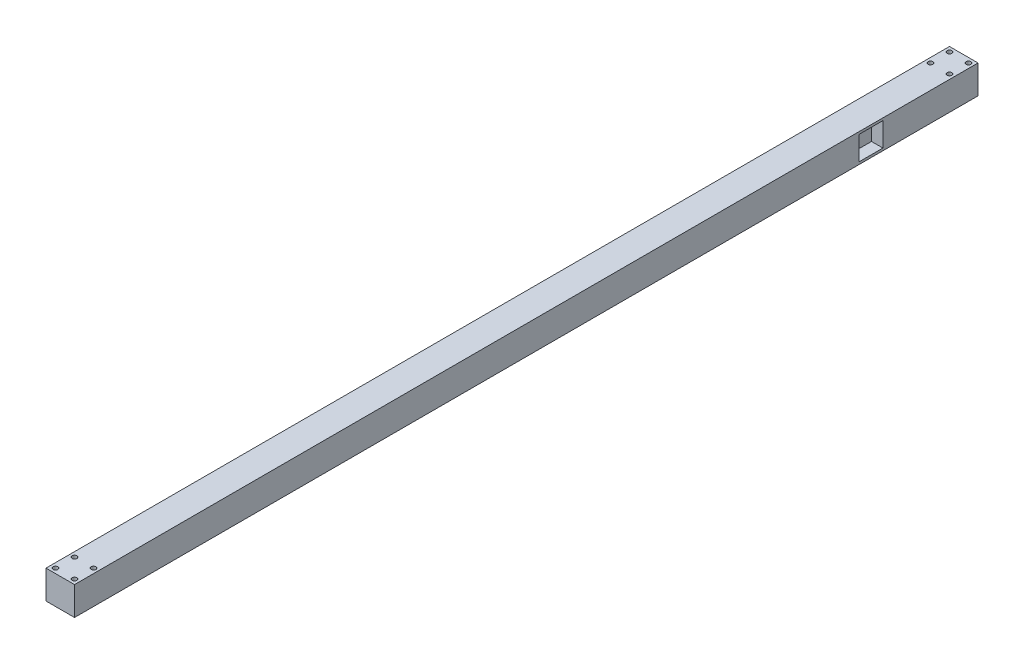
ISO-10303-21;
HEADER;
FILE_DESCRIPTION(('STEP AP214'),'2;1');
FILE_NAME('part.step','',(''),(''),'','','');
FILE_SCHEMA(('AUTOMOTIVE_DESIGN { 1 0 10303 214 1 1 1 1 }'));
ENDSEC;
DATA;
#1=APPLICATION_CONTEXT('core data for automotive mechanical design processes');
#2=APPLICATION_PROTOCOL_DEFINITION('international standard','automotive_design',2000,#1);
#3=PRODUCT_CONTEXT('',#1,'mechanical');
#4=PRODUCT('Part','Part','',(#3));
#5=PRODUCT_RELATED_PRODUCT_CATEGORY('part','',(#4));
#6=PRODUCT_DEFINITION_FORMATION('','',#4);
#7=PRODUCT_DEFINITION_CONTEXT('part definition',#1,'design');
#8=PRODUCT_DEFINITION('design','',#6,#7);
#9=PRODUCT_DEFINITION_SHAPE('','',#8);
#10=(LENGTH_UNIT() NAMED_UNIT(*) SI_UNIT(.MILLI.,.METRE.));
#11=(NAMED_UNIT(*) PLANE_ANGLE_UNIT() SI_UNIT($,.RADIAN.));
#12=(NAMED_UNIT(*) SI_UNIT($,.STERADIAN.) SOLID_ANGLE_UNIT());
#13=UNCERTAINTY_MEASURE_WITH_UNIT(LENGTH_MEASURE(1.E-05),#10,'distance_accuracy_value','');
#14=(GEOMETRIC_REPRESENTATION_CONTEXT(3) GLOBAL_UNCERTAINTY_ASSIGNED_CONTEXT((#13)) GLOBAL_UNIT_ASSIGNED_CONTEXT((#10,
#11,#12)) REPRESENTATION_CONTEXT('',''));
#15=CARTESIAN_POINT('',(0.,0.,0.));
#16=DIRECTION('',(0.,0.,1.));
#17=DIRECTION('',(1.,0.,0.));
#18=AXIS2_PLACEMENT_3D('',#15,#16,#17);
#19=CARTESIAN_POINT('',(15.,15.,950.));
#20=DIRECTION('',(-1.,0.,0.));
#21=DIRECTION('',(0.,-1.,0.));
#22=AXIS2_PLACEMENT_3D('',#19,#20,#21);
#23=PLANE('',#22);
#24=DIRECTION('',(0.,0.,1.));
#25=VECTOR('',#24,1.);
#26=CARTESIAN_POINT('',(15.,12.5,125.));
#27=LINE('',#26,#25);
#28=CARTESIAN_POINT('',(15.,12.5,100.));
#29=VERTEX_POINT('',#28);
#30=CARTESIAN_POINT('',(15.,12.5,125.));
#31=VERTEX_POINT('',#30);
#32=EDGE_CURVE('E139',#29,#31,#27,.T.);
#33=ORIENTED_EDGE('',*,*,#32,.F.);
#34=DIRECTION('',(0.,1.,0.));
#35=VECTOR('',#34,1.);
#36=CARTESIAN_POINT('',(15.,12.5,100.));
#37=LINE('',#36,#35);
#38=CARTESIAN_POINT('',(15.,-12.5,99.9999999999999));
#39=VERTEX_POINT('',#38);
#40=EDGE_CURVE('E51',#39,#29,#37,.T.);
#41=ORIENTED_EDGE('',*,*,#40,.F.);
#42=DIRECTION('',(0.,0.,-1.));
#43=VECTOR('',#42,1.);
#44=CARTESIAN_POINT('',(15.,-12.5,125.));
#45=LINE('',#44,#43);
#46=CARTESIAN_POINT('',(15.,-12.5,125.));
#47=VERTEX_POINT('',#46);
#48=EDGE_CURVE('E130',#47,#39,#45,.T.);
#49=ORIENTED_EDGE('',*,*,#48,.F.);
#50=DIRECTION('',(0.,-1.,0.));
#51=VECTOR('',#50,1.);
#52=CARTESIAN_POINT('',(15.,12.5,125.));
#53=LINE('',#52,#51);
#54=EDGE_CURVE('E133',#31,#47,#53,.T.);
#55=ORIENTED_EDGE('',*,*,#54,.F.);
#56=EDGE_LOOP('',(#33,#41,#49,#55));
#57=FACE_BOUND('',#56,.T.);
#58=DIRECTION('',(0.,1.,0.));
#59=VECTOR('',#58,1.);
#60=CARTESIAN_POINT('',(15.,15.,0.));
#61=LINE('',#60,#59);
#62=CARTESIAN_POINT('',(15.,-15.,0.));
#63=VERTEX_POINT('',#62);
#64=CARTESIAN_POINT('',(15.,15.,0.));
#65=VERTEX_POINT('',#64);
#66=EDGE_CURVE('E194',#63,#65,#61,.T.);
#67=ORIENTED_EDGE('',*,*,#66,.T.);
#68=DIRECTION('',(0.,0.,-1.));
#69=VECTOR('',#68,1.);
#70=CARTESIAN_POINT('',(15.,15.,950.));
#71=LINE('',#70,#69);
#72=CARTESIAN_POINT('',(15.,15.,950.));
#73=VERTEX_POINT('',#72);
#74=EDGE_CURVE('E11',#73,#65,#71,.T.);
#75=ORIENTED_EDGE('',*,*,#74,.F.);
#76=DIRECTION('',(0.,1.,0.));
#77=VECTOR('',#76,1.);
#78=CARTESIAN_POINT('',(15.,15.,950.));
#79=LINE('',#78,#77);
#80=CARTESIAN_POINT('',(15.,-15.,950.));
#81=VERTEX_POINT('',#80);
#82=EDGE_CURVE('E197',#81,#73,#79,.T.);
#83=ORIENTED_EDGE('',*,*,#82,.F.);
#84=DIRECTION('',(0.,0.,-1.));
#85=VECTOR('',#84,1.);
#86=CARTESIAN_POINT('',(15.,-15.,950.));
#87=LINE('',#86,#85);
#88=EDGE_CURVE('E203',#81,#63,#87,.T.);
#89=ORIENTED_EDGE('',*,*,#88,.T.);
#90=EDGE_LOOP('',(#67,#75,#83,#89));
#91=FACE_BOUND('',#90,.T.);
#92=ADVANCED_FACE('F37',(#57,#91),#23,.F.);
#93=CARTESIAN_POINT('',(-15.,15.,950.));
#94=DIRECTION('',(0.,-1.,0.));
#95=DIRECTION('',(0.,0.,-1.));
#96=AXIS2_PLACEMENT_3D('',#93,#94,#95);
#97=PLANE('',#96);
#98=CARTESIAN_POINT('',(10.,15.,925.));
#99=DIRECTION('',(0.,1.,0.));
#100=DIRECTION('',(0.,0.,1.));
#101=AXIS2_PLACEMENT_3D('',#98,#99,#100);
#102=CIRCLE('',#101,2.5);
#103=CARTESIAN_POINT('',(10.,15.,927.5));
#104=VERTEX_POINT('',#103);
#105=EDGE_CURVE('E171',#104,#104,#102,.T.);
#106=ORIENTED_EDGE('',*,*,#105,.F.);
#107=EDGE_LOOP('',(#106));
#108=FACE_BOUND('',#107,.T.);
#109=CARTESIAN_POINT('',(10.,15.,945.));
#110=DIRECTION('',(0.,1.,0.));
#111=DIRECTION('',(0.,0.,1.));
#112=AXIS2_PLACEMENT_3D('',#109,#110,#111);
#113=CIRCLE('',#112,2.5);
#114=CARTESIAN_POINT('',(10.,15.,947.5));
#115=VERTEX_POINT('',#114);
#116=EDGE_CURVE('E177',#115,#115,#113,.T.);
#117=ORIENTED_EDGE('',*,*,#116,.F.);
#118=EDGE_LOOP('',(#117));
#119=FACE_BOUND('',#118,.T.);
#120=CARTESIAN_POINT('',(-10.,15.,945.));
#121=DIRECTION('',(0.,1.,0.));
#122=DIRECTION('',(0.,0.,1.));
#123=AXIS2_PLACEMENT_3D('',#120,#121,#122);
#124=CIRCLE('',#123,2.5);
#125=CARTESIAN_POINT('',(-10.,15.,947.5));
#126=VERTEX_POINT('',#125);
#127=EDGE_CURVE('E183',#126,#126,#124,.T.);
#128=ORIENTED_EDGE('',*,*,#127,.F.);
#129=EDGE_LOOP('',(#128));
#130=FACE_BOUND('',#129,.T.);
#131=CARTESIAN_POINT('',(-10.,15.,5.));
#132=DIRECTION('',(0.,1.,0.));
#133=DIRECTION('',(0.,0.,1.));
#134=AXIS2_PLACEMENT_3D('',#131,#132,#133);
#135=CIRCLE('',#134,2.5);
#136=CARTESIAN_POINT('',(-10.,15.,7.5));
#137=VERTEX_POINT('',#136);
#138=EDGE_CURVE('E152',#137,#137,#135,.T.);
#139=ORIENTED_EDGE('',*,*,#138,.F.);
#140=EDGE_LOOP('',(#139));
#141=FACE_BOUND('',#140,.T.);
#142=CARTESIAN_POINT('',(10.,15.,5.));
#143=DIRECTION('',(0.,1.,0.));
#144=DIRECTION('',(0.,0.,1.));
#145=AXIS2_PLACEMENT_3D('',#142,#143,#144);
#146=CIRCLE('',#145,2.5);
#147=CARTESIAN_POINT('',(10.,15.,7.5));
#148=VERTEX_POINT('',#147);
#149=EDGE_CURVE('E153',#148,#148,#146,.T.);
#150=ORIENTED_EDGE('',*,*,#149,.F.);
#151=EDGE_LOOP('',(#150));
#152=FACE_BOUND('',#151,.T.);
#153=CARTESIAN_POINT('',(10.,15.,25.));
#154=DIRECTION('',(0.,1.,0.));
#155=DIRECTION('',(0.,0.,1.));
#156=AXIS2_PLACEMENT_3D('',#153,#154,#155);
#157=CIRCLE('',#156,2.5);
#158=CARTESIAN_POINT('',(10.,15.,27.5));
#159=VERTEX_POINT('',#158);
#160=EDGE_CURVE('E159',#159,#159,#157,.T.);
#161=ORIENTED_EDGE('',*,*,#160,.F.);
#162=EDGE_LOOP('',(#161));
#163=FACE_BOUND('',#162,.T.);
#164=CARTESIAN_POINT('',(-10.,15.,25.));
#165=DIRECTION('',(0.,1.,0.));
#166=DIRECTION('',(0.,0.,1.));
#167=AXIS2_PLACEMENT_3D('',#164,#165,#166);
#168=CIRCLE('',#167,2.5);
#169=CARTESIAN_POINT('',(-10.,15.,27.5));
#170=VERTEX_POINT('',#169);
#171=EDGE_CURVE('E145',#170,#170,#168,.T.);
#172=ORIENTED_EDGE('',*,*,#171,.F.);
#173=EDGE_LOOP('',(#172));
#174=FACE_BOUND('',#173,.T.);
#175=CARTESIAN_POINT('',(-10.,15.,925.));
#176=DIRECTION('',(0.,1.,0.));
#177=DIRECTION('',(0.,0.,1.));
#178=AXIS2_PLACEMENT_3D('',#175,#176,#177);
#179=CIRCLE('',#178,2.5);
#180=CARTESIAN_POINT('',(-10.,15.,927.5));
#181=VERTEX_POINT('',#180);
#182=EDGE_CURVE('E170',#181,#181,#179,.T.);
#183=ORIENTED_EDGE('',*,*,#182,.F.);
#184=EDGE_LOOP('',(#183));
#185=FACE_BOUND('',#184,.T.);
#186=DIRECTION('',(-1.,0.,0.));
#187=VECTOR('',#186,1.);
#188=CARTESIAN_POINT('',(-15.,15.,0.));
#189=LINE('',#188,#187);
#190=CARTESIAN_POINT('',(-15.,15.,0.));
#191=VERTEX_POINT('',#190);
#192=EDGE_CURVE('E206',#65,#191,#189,.T.);
#193=ORIENTED_EDGE('',*,*,#192,.T.);
#194=DIRECTION('',(0.,0.,-1.));
#195=VECTOR('',#194,1.);
#196=CARTESIAN_POINT('',(-15.,15.,950.));
#197=LINE('',#196,#195);
#198=CARTESIAN_POINT('',(-15.,15.,950.));
#199=VERTEX_POINT('',#198);
#200=EDGE_CURVE('E44',#199,#191,#197,.T.);
#201=ORIENTED_EDGE('',*,*,#200,.F.);
#202=DIRECTION('',(-1.,0.,0.));
#203=VECTOR('',#202,1.);
#204=CARTESIAN_POINT('',(-15.,15.,950.));
#205=LINE('',#204,#203);
#206=EDGE_CURVE('E88',#73,#199,#205,.T.);
#207=ORIENTED_EDGE('',*,*,#206,.F.);
#208=ORIENTED_EDGE('',*,*,#74,.T.);
#209=EDGE_LOOP('',(#193,#201,#207,#208));
#210=FACE_BOUND('',#209,.T.);
#211=ADVANCED_FACE('F235',(#108,#119,#130,#141,#152,#163,#174,#185,#210),#97,.F.);
#212=CARTESIAN_POINT('',(-15.,15.,950.));
#213=DIRECTION('',(1.,0.,0.));
#214=DIRECTION('',(0.,1.,0.));
#215=AXIS2_PLACEMENT_3D('',#212,#213,#214);
#216=PLANE('',#215);
#217=DIRECTION('',(0.,-1.,0.));
#218=VECTOR('',#217,1.);
#219=CARTESIAN_POINT('',(-15.,15.,0.));
#220=LINE('',#219,#218);
#221=CARTESIAN_POINT('',(-15.,-15.,0.));
#222=VERTEX_POINT('',#221);
#223=EDGE_CURVE('E208',#191,#222,#220,.T.);
#224=ORIENTED_EDGE('',*,*,#223,.T.);
#225=DIRECTION('',(0.,0.,-1.));
#226=VECTOR('',#225,1.);
#227=CARTESIAN_POINT('',(-15.,-15.,950.));
#228=LINE('',#227,#226);
#229=CARTESIAN_POINT('',(-15.,-15.,950.));
#230=VERTEX_POINT('',#229);
#231=EDGE_CURVE('E212',#230,#222,#228,.T.);
#232=ORIENTED_EDGE('',*,*,#231,.F.);
#233=DIRECTION('',(0.,-1.,0.));
#234=VECTOR('',#233,1.);
#235=CARTESIAN_POINT('',(-15.,15.,950.));
#236=LINE('',#235,#234);
#237=EDGE_CURVE('E200',#199,#230,#236,.T.);
#238=ORIENTED_EDGE('',*,*,#237,.F.);
#239=ORIENTED_EDGE('',*,*,#200,.T.);
#240=EDGE_LOOP('',(#224,#232,#238,#239));
#241=FACE_BOUND('',#240,.T.);
#242=ADVANCED_FACE('F217',(#241),#216,.F.);
#243=CARTESIAN_POINT('',(-15.,-15.,950.));
#244=DIRECTION('',(0.,1.,0.));
#245=DIRECTION('',(0.,0.,1.));
#246=AXIS2_PLACEMENT_3D('',#243,#244,#245);
#247=PLANE('',#246);
#248=CARTESIAN_POINT('',(10.,-15.,925.));
#249=DIRECTION('',(0.,1.,0.));
#250=DIRECTION('',(0.,0.,1.));
#251=AXIS2_PLACEMENT_3D('',#248,#249,#250);
#252=CIRCLE('',#251,2.5);
#253=CARTESIAN_POINT('',(10.,-15.,927.5));
#254=VERTEX_POINT('',#253);
#255=EDGE_CURVE('E167',#254,#254,#252,.T.);
#256=ORIENTED_EDGE('',*,*,#255,.T.);
#257=EDGE_LOOP('',(#256));
#258=FACE_BOUND('',#257,.T.);
#259=CARTESIAN_POINT('',(10.,-15.,945.));
#260=DIRECTION('',(0.,1.,0.));
#261=DIRECTION('',(0.,0.,1.));
#262=AXIS2_PLACEMENT_3D('',#259,#260,#261);
#263=CIRCLE('',#262,2.5);
#264=CARTESIAN_POINT('',(10.,-15.,947.5));
#265=VERTEX_POINT('',#264);
#266=EDGE_CURVE('E174',#265,#265,#263,.T.);
#267=ORIENTED_EDGE('',*,*,#266,.T.);
#268=EDGE_LOOP('',(#267));
#269=FACE_BOUND('',#268,.T.);
#270=CARTESIAN_POINT('',(-10.,-15.,945.));
#271=DIRECTION('',(0.,1.,0.));
#272=DIRECTION('',(0.,0.,1.));
#273=AXIS2_PLACEMENT_3D('',#270,#271,#272);
#274=CIRCLE('',#273,2.5);
#275=CARTESIAN_POINT('',(-10.,-15.,947.5));
#276=VERTEX_POINT('',#275);
#277=EDGE_CURVE('E180',#276,#276,#274,.T.);
#278=ORIENTED_EDGE('',*,*,#277,.T.);
#279=EDGE_LOOP('',(#278));
#280=FACE_BOUND('',#279,.T.);
#281=CARTESIAN_POINT('',(-10.,-15.,5.));
#282=DIRECTION('',(0.,1.,0.));
#283=DIRECTION('',(0.,0.,1.));
#284=AXIS2_PLACEMENT_3D('',#281,#282,#283);
#285=CIRCLE('',#284,2.5);
#286=CARTESIAN_POINT('',(-10.,-15.,7.5));
#287=VERTEX_POINT('',#286);
#288=EDGE_CURVE('E186',#287,#287,#285,.T.);
#289=ORIENTED_EDGE('',*,*,#288,.T.);
#290=EDGE_LOOP('',(#289));
#291=FACE_BOUND('',#290,.T.);
#292=CARTESIAN_POINT('',(10.,-15.,5.));
#293=DIRECTION('',(0.,1.,0.));
#294=DIRECTION('',(0.,0.,1.));
#295=AXIS2_PLACEMENT_3D('',#292,#293,#294);
#296=CIRCLE('',#295,2.5);
#297=CARTESIAN_POINT('',(10.,-15.,7.5));
#298=VERTEX_POINT('',#297);
#299=EDGE_CURVE('E149',#298,#298,#296,.T.);
#300=ORIENTED_EDGE('',*,*,#299,.T.);
#301=EDGE_LOOP('',(#300));
#302=FACE_BOUND('',#301,.T.);
#303=CARTESIAN_POINT('',(10.,-15.,25.));
#304=DIRECTION('',(0.,1.,0.));
#305=DIRECTION('',(0.,0.,1.));
#306=AXIS2_PLACEMENT_3D('',#303,#304,#305);
#307=CIRCLE('',#306,2.5);
#308=CARTESIAN_POINT('',(10.,-15.,27.5));
#309=VERTEX_POINT('',#308);
#310=EDGE_CURVE('E156',#309,#309,#307,.T.);
#311=ORIENTED_EDGE('',*,*,#310,.T.);
#312=EDGE_LOOP('',(#311));
#313=FACE_BOUND('',#312,.T.);
#314=CARTESIAN_POINT('',(-10.,-15.,25.));
#315=DIRECTION('',(0.,1.,0.));
#316=DIRECTION('',(0.,0.,1.));
#317=AXIS2_PLACEMENT_3D('',#314,#315,#316);
#318=CIRCLE('',#317,2.5);
#319=CARTESIAN_POINT('',(-10.,-15.,27.5));
#320=VERTEX_POINT('',#319);
#321=EDGE_CURVE('E162',#320,#320,#318,.T.);
#322=ORIENTED_EDGE('',*,*,#321,.T.);
#323=EDGE_LOOP('',(#322));
#324=FACE_BOUND('',#323,.T.);
#325=CARTESIAN_POINT('',(-10.,-15.,925.));
#326=DIRECTION('',(0.,1.,0.));
#327=DIRECTION('',(0.,0.,1.));
#328=AXIS2_PLACEMENT_3D('',#325,#326,#327);
#329=CIRCLE('',#328,2.5);
#330=CARTESIAN_POINT('',(-10.,-15.,927.5));
#331=VERTEX_POINT('',#330);
#332=EDGE_CURVE('E191',#331,#331,#329,.T.);
#333=ORIENTED_EDGE('',*,*,#332,.T.);
#334=EDGE_LOOP('',(#333));
#335=FACE_BOUND('',#334,.T.);
#336=DIRECTION('',(1.,0.,0.));
#337=VECTOR('',#336,1.);
#338=CARTESIAN_POINT('',(-15.,-15.,0.));
#339=LINE('',#338,#337);
#340=EDGE_CURVE('E81',#222,#63,#339,.T.);
#341=ORIENTED_EDGE('',*,*,#340,.T.);
#342=ORIENTED_EDGE('',*,*,#88,.F.);
#343=DIRECTION('',(1.,0.,0.));
#344=VECTOR('',#343,1.);
#345=CARTESIAN_POINT('',(-15.,-15.,950.));
#346=LINE('',#345,#344);
#347=EDGE_CURVE('E60',#230,#81,#346,.T.);
#348=ORIENTED_EDGE('',*,*,#347,.F.);
#349=ORIENTED_EDGE('',*,*,#231,.T.);
#350=EDGE_LOOP('',(#341,#342,#348,#349));
#351=FACE_BOUND('',#350,.T.);
#352=ADVANCED_FACE('F225',(#258,#269,#280,#291,#302,#313,#324,#335,#351),#247,.F.);
#353=CARTESIAN_POINT('',(0.,0.,950.));
#354=DIRECTION('',(0.,0.,1.));
#355=DIRECTION('',(1.,0.,0.));
#356=AXIS2_PLACEMENT_3D('',#353,#354,#355);
#357=PLANE('',#356);
#358=ORIENTED_EDGE('',*,*,#82,.T.);
#359=ORIENTED_EDGE('',*,*,#206,.T.);
#360=ORIENTED_EDGE('',*,*,#237,.T.);
#361=ORIENTED_EDGE('',*,*,#347,.T.);
#362=EDGE_LOOP('',(#358,#359,#360,#361));
#363=FACE_BOUND('',#362,.T.);
#364=ADVANCED_FACE('F227',(#363),#357,.T.);
#365=CARTESIAN_POINT('',(0.,0.,0.));
#366=DIRECTION('',(0.,0.,1.));
#367=DIRECTION('',(1.,0.,0.));
#368=AXIS2_PLACEMENT_3D('',#365,#366,#367);
#369=PLANE('',#368);
#370=ORIENTED_EDGE('',*,*,#66,.F.);
#371=ORIENTED_EDGE('',*,*,#340,.F.);
#372=ORIENTED_EDGE('',*,*,#223,.F.);
#373=ORIENTED_EDGE('',*,*,#192,.F.);
#374=EDGE_LOOP('',(#370,#371,#372,#373));
#375=FACE_BOUND('',#374,.T.);
#376=ADVANCED_FACE('F221',(#375),#369,.F.);
#377=CARTESIAN_POINT('',(-10.,-15.,925.));
#378=DIRECTION('',(0.,1.,0.));
#379=DIRECTION('',(0.,0.,1.));
#380=AXIS2_PLACEMENT_3D('',#377,#378,#379);
#381=CYLINDRICAL_SURFACE('',#380,2.5);
#382=ORIENTED_EDGE('',*,*,#332,.F.);
#383=EDGE_LOOP('',(#382));
#384=FACE_BOUND('',#383,.T.);
#385=ORIENTED_EDGE('',*,*,#182,.T.);
#386=EDGE_LOOP('',(#385));
#387=FACE_BOUND('',#386,.T.);
#388=ADVANCED_FACE('F276',(#384,#387),#381,.F.);
#389=CARTESIAN_POINT('',(-10.,-15.,25.));
#390=DIRECTION('',(0.,1.,0.));
#391=DIRECTION('',(0.,0.,1.));
#392=AXIS2_PLACEMENT_3D('',#389,#390,#391);
#393=CYLINDRICAL_SURFACE('',#392,2.5);
#394=ORIENTED_EDGE('',*,*,#321,.F.);
#395=EDGE_LOOP('',(#394));
#396=FACE_BOUND('',#395,.T.);
#397=ORIENTED_EDGE('',*,*,#171,.T.);
#398=EDGE_LOOP('',(#397));
#399=FACE_BOUND('',#398,.T.);
#400=ADVANCED_FACE('F272',(#396,#399),#393,.F.);
#401=CARTESIAN_POINT('',(10.,-15.,25.));
#402=DIRECTION('',(0.,1.,0.));
#403=DIRECTION('',(0.,0.,1.));
#404=AXIS2_PLACEMENT_3D('',#401,#402,#403);
#405=CYLINDRICAL_SURFACE('',#404,2.5);
#406=ORIENTED_EDGE('',*,*,#310,.F.);
#407=EDGE_LOOP('',(#406));
#408=FACE_BOUND('',#407,.T.);
#409=ORIENTED_EDGE('',*,*,#160,.T.);
#410=EDGE_LOOP('',(#409));
#411=FACE_BOUND('',#410,.T.);
#412=ADVANCED_FACE('F268',(#408,#411),#405,.F.);
#413=CARTESIAN_POINT('',(10.,-15.,5.));
#414=DIRECTION('',(0.,1.,0.));
#415=DIRECTION('',(0.,0.,1.));
#416=AXIS2_PLACEMENT_3D('',#413,#414,#415);
#417=CYLINDRICAL_SURFACE('',#416,2.5);
#418=ORIENTED_EDGE('',*,*,#299,.F.);
#419=EDGE_LOOP('',(#418));
#420=FACE_BOUND('',#419,.T.);
#421=ORIENTED_EDGE('',*,*,#149,.T.);
#422=EDGE_LOOP('',(#421));
#423=FACE_BOUND('',#422,.T.);
#424=ADVANCED_FACE('F264',(#420,#423),#417,.F.);
#425=CARTESIAN_POINT('',(-10.,-15.,5.));
#426=DIRECTION('',(0.,1.,0.));
#427=DIRECTION('',(0.,0.,1.));
#428=AXIS2_PLACEMENT_3D('',#425,#426,#427);
#429=CYLINDRICAL_SURFACE('',#428,2.5);
#430=ORIENTED_EDGE('',*,*,#288,.F.);
#431=EDGE_LOOP('',(#430));
#432=FACE_BOUND('',#431,.T.);
#433=ORIENTED_EDGE('',*,*,#138,.T.);
#434=EDGE_LOOP('',(#433));
#435=FACE_BOUND('',#434,.T.);
#436=ADVANCED_FACE('F267',(#432,#435),#429,.F.);
#437=CARTESIAN_POINT('',(-10.,-15.,945.));
#438=DIRECTION('',(0.,1.,0.));
#439=DIRECTION('',(0.,0.,1.));
#440=AXIS2_PLACEMENT_3D('',#437,#438,#439);
#441=CYLINDRICAL_SURFACE('',#440,2.5);
#442=ORIENTED_EDGE('',*,*,#277,.F.);
#443=EDGE_LOOP('',(#442));
#444=FACE_BOUND('',#443,.T.);
#445=ORIENTED_EDGE('',*,*,#127,.T.);
#446=EDGE_LOOP('',(#445));
#447=FACE_BOUND('',#446,.T.);
#448=ADVANCED_FACE('F284',(#444,#447),#441,.F.);
#449=CARTESIAN_POINT('',(10.,-15.,945.));
#450=DIRECTION('',(0.,1.,0.));
#451=DIRECTION('',(0.,0.,1.));
#452=AXIS2_PLACEMENT_3D('',#449,#450,#451);
#453=CYLINDRICAL_SURFACE('',#452,2.5);
#454=ORIENTED_EDGE('',*,*,#266,.F.);
#455=EDGE_LOOP('',(#454));
#456=FACE_BOUND('',#455,.T.);
#457=ORIENTED_EDGE('',*,*,#116,.T.);
#458=EDGE_LOOP('',(#457));
#459=FACE_BOUND('',#458,.T.);
#460=ADVANCED_FACE('F280',(#456,#459),#453,.F.);
#461=CARTESIAN_POINT('',(10.,-15.,925.));
#462=DIRECTION('',(0.,1.,0.));
#463=DIRECTION('',(0.,0.,1.));
#464=AXIS2_PLACEMENT_3D('',#461,#462,#463);
#465=CYLINDRICAL_SURFACE('',#464,2.5);
#466=ORIENTED_EDGE('',*,*,#255,.F.);
#467=EDGE_LOOP('',(#466));
#468=FACE_BOUND('',#467,.T.);
#469=ORIENTED_EDGE('',*,*,#105,.T.);
#470=EDGE_LOOP('',(#469));
#471=FACE_BOUND('',#470,.T.);
#472=ADVANCED_FACE('F258',(#468,#471),#465,.F.);
#473=CARTESIAN_POINT('',(3.,12.5,100.));
#474=DIRECTION('',(0.,0.,-1.));
#475=DIRECTION('',(0.,1.,0.));
#476=AXIS2_PLACEMENT_3D('',#473,#474,#475);
#477=PLANE('',#476);
#478=ORIENTED_EDGE('',*,*,#40,.T.);
#479=DIRECTION('',(1.,0.,0.));
#480=VECTOR('',#479,1.);
#481=CARTESIAN_POINT('',(3.,12.5,100.));
#482=LINE('',#481,#480);
#483=CARTESIAN_POINT('',(3.,12.5,100.));
#484=VERTEX_POINT('',#483);
#485=EDGE_CURVE('E108',#484,#29,#482,.T.);
#486=ORIENTED_EDGE('',*,*,#485,.F.);
#487=DIRECTION('',(0.,1.,0.));
#488=VECTOR('',#487,1.);
#489=CARTESIAN_POINT('',(3.,12.5,100.));
#490=LINE('',#489,#488);
#491=CARTESIAN_POINT('',(3.,-12.5,99.9999999999999));
#492=VERTEX_POINT('',#491);
#493=EDGE_CURVE('E112',#492,#484,#490,.T.);
#494=ORIENTED_EDGE('',*,*,#493,.F.);
#495=DIRECTION('',(1.,0.,0.));
#496=VECTOR('',#495,1.);
#497=CARTESIAN_POINT('',(3.,-12.5,99.9999999999999));
#498=LINE('',#497,#496);
#499=EDGE_CURVE('E143',#492,#39,#498,.T.);
#500=ORIENTED_EDGE('',*,*,#499,.T.);
#501=EDGE_LOOP('',(#478,#486,#494,#500));
#502=FACE_BOUND('',#501,.T.);
#503=ADVANCED_FACE('F110',(#502),#477,.F.);
#504=CARTESIAN_POINT('',(3.,-12.5,125.));
#505=DIRECTION('',(0.,-1.,0.));
#506=DIRECTION('',(1.,0.,0.));
#507=AXIS2_PLACEMENT_3D('',#504,#505,#506);
#508=PLANE('',#507);
#509=ORIENTED_EDGE('',*,*,#48,.T.);
#510=ORIENTED_EDGE('',*,*,#499,.F.);
#511=DIRECTION('',(0.,0.,-1.));
#512=VECTOR('',#511,1.);
#513=CARTESIAN_POINT('',(3.,-12.5,125.));
#514=LINE('',#513,#512);
#515=CARTESIAN_POINT('',(3.,-12.5,125.));
#516=VERTEX_POINT('',#515);
#517=EDGE_CURVE('E118',#516,#492,#514,.T.);
#518=ORIENTED_EDGE('',*,*,#517,.F.);
#519=DIRECTION('',(1.,0.,0.));
#520=VECTOR('',#519,1.);
#521=CARTESIAN_POINT('',(3.,-12.5,125.));
#522=LINE('',#521,#520);
#523=EDGE_CURVE('E146',#516,#47,#522,.T.);
#524=ORIENTED_EDGE('',*,*,#523,.T.);
#525=EDGE_LOOP('',(#509,#510,#518,#524));
#526=FACE_BOUND('',#525,.T.);
#527=ADVANCED_FACE('F250',(#526),#508,.F.);
#528=CARTESIAN_POINT('',(3.,12.5,125.));
#529=DIRECTION('',(0.,0.,1.));
#530=DIRECTION('',(1.,0.,0.));
#531=AXIS2_PLACEMENT_3D('',#528,#529,#530);
#532=PLANE('',#531);
#533=ORIENTED_EDGE('',*,*,#54,.T.);
#534=ORIENTED_EDGE('',*,*,#523,.F.);
#535=DIRECTION('',(0.,-1.,0.));
#536=VECTOR('',#535,1.);
#537=CARTESIAN_POINT('',(3.,12.5,125.));
#538=LINE('',#537,#536);
#539=CARTESIAN_POINT('',(3.,12.5,125.));
#540=VERTEX_POINT('',#539);
#541=EDGE_CURVE('E126',#540,#516,#538,.T.);
#542=ORIENTED_EDGE('',*,*,#541,.F.);
#543=DIRECTION('',(1.,0.,0.));
#544=VECTOR('',#543,1.);
#545=CARTESIAN_POINT('',(3.,12.5,125.));
#546=LINE('',#545,#544);
#547=EDGE_CURVE('E117',#540,#31,#546,.T.);
#548=ORIENTED_EDGE('',*,*,#547,.T.);
#549=EDGE_LOOP('',(#533,#534,#542,#548));
#550=FACE_BOUND('',#549,.T.);
#551=ADVANCED_FACE('F248',(#550),#532,.F.);
#552=CARTESIAN_POINT('',(3.,12.5,125.));
#553=DIRECTION('',(0.,1.,0.));
#554=DIRECTION('',(-1.,0.,0.));
#555=AXIS2_PLACEMENT_3D('',#552,#553,#554);
#556=PLANE('',#555);
#557=ORIENTED_EDGE('',*,*,#32,.T.);
#558=ORIENTED_EDGE('',*,*,#547,.F.);
#559=DIRECTION('',(0.,0.,1.));
#560=VECTOR('',#559,1.);
#561=CARTESIAN_POINT('',(3.,12.5,125.));
#562=LINE('',#561,#560);
#563=EDGE_CURVE('E121',#484,#540,#562,.T.);
#564=ORIENTED_EDGE('',*,*,#563,.F.);
#565=ORIENTED_EDGE('',*,*,#485,.T.);
#566=EDGE_LOOP('',(#557,#558,#564,#565));
#567=FACE_BOUND('',#566,.T.);
#568=ADVANCED_FACE('F122',(#567),#556,.F.);
#569=CARTESIAN_POINT('',(3.,0.,0.));
#570=DIRECTION('',(1.,0.,0.));
#571=DIRECTION('',(0.,1.,0.));
#572=AXIS2_PLACEMENT_3D('',#569,#570,#571);
#573=PLANE('',#572);
#574=ORIENTED_EDGE('',*,*,#493,.T.);
#575=ORIENTED_EDGE('',*,*,#563,.T.);
#576=ORIENTED_EDGE('',*,*,#541,.T.);
#577=ORIENTED_EDGE('',*,*,#517,.T.);
#578=EDGE_LOOP('',(#574,#575,#576,#577));
#579=FACE_BOUND('',#578,.T.);
#580=ADVANCED_FACE('F128',(#579),#573,.T.);
#581=CLOSED_SHELL('',(#92,#211,#242,#352,#364,#376,#388,#400,#412,#424,#436,#448,#460,#472,#503,
#527,#551,#568,#580));
#582=MANIFOLD_SOLID_BREP('B2',#581);
#583=ADVANCED_BREP_SHAPE_REPRESENTATION('',(#18,#582),#14);
#584=SHAPE_DEFINITION_REPRESENTATION(#9,#583);
ENDSEC;
END-ISO-10303-21;
